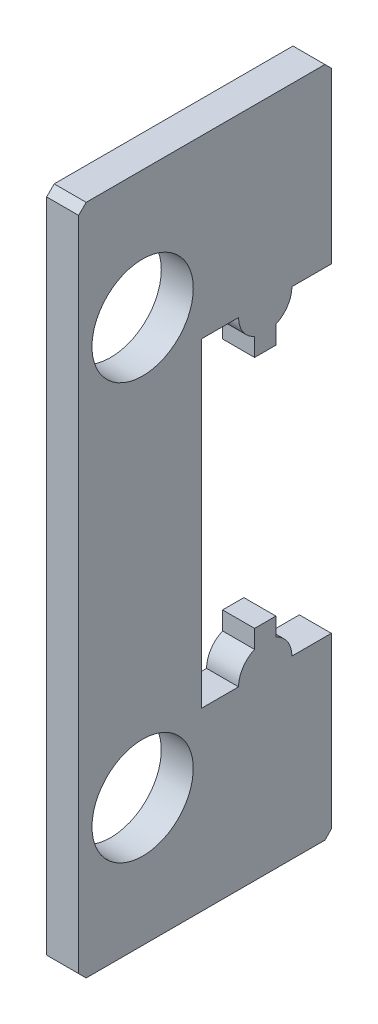
ISO-10303-21;
HEADER;
FILE_DESCRIPTION(('STEP AP214'),'2;1');
FILE_NAME('part.step','',(''),(''),'','','');
FILE_SCHEMA(('AUTOMOTIVE_DESIGN { 1 0 10303 214 1 1 1 1 }'));
ENDSEC;
DATA;
#1=APPLICATION_CONTEXT('core data for automotive mechanical design processes');
#2=APPLICATION_PROTOCOL_DEFINITION('international standard','automotive_design',2000,#1);
#3=PRODUCT_CONTEXT('',#1,'mechanical');
#4=PRODUCT('Part','Part','',(#3));
#5=PRODUCT_RELATED_PRODUCT_CATEGORY('part','',(#4));
#6=PRODUCT_DEFINITION_FORMATION('','',#4);
#7=PRODUCT_DEFINITION_CONTEXT('part definition',#1,'design');
#8=PRODUCT_DEFINITION('design','',#6,#7);
#9=PRODUCT_DEFINITION_SHAPE('','',#8);
#10=(LENGTH_UNIT() NAMED_UNIT(*) SI_UNIT(.MILLI.,.METRE.));
#11=(NAMED_UNIT(*) PLANE_ANGLE_UNIT() SI_UNIT($,.RADIAN.));
#12=(NAMED_UNIT(*) SI_UNIT($,.STERADIAN.) SOLID_ANGLE_UNIT());
#13=UNCERTAINTY_MEASURE_WITH_UNIT(LENGTH_MEASURE(1.E-05),#10,'distance_accuracy_value','');
#14=(GEOMETRIC_REPRESENTATION_CONTEXT(3) GLOBAL_UNCERTAINTY_ASSIGNED_CONTEXT((#13)) GLOBAL_UNIT_ASSIGNED_CONTEXT((#10,
#11,#12)) REPRESENTATION_CONTEXT('',''));
#15=CARTESIAN_POINT('',(0.,0.,0.));
#16=DIRECTION('',(0.,0.,1.));
#17=DIRECTION('',(1.,0.,0.));
#18=AXIS2_PLACEMENT_3D('',#15,#16,#17);
#19=CARTESIAN_POINT('',(19.75,0.,3.5));
#20=DIRECTION('',(-1.,0.,0.));
#21=DIRECTION('',(0.,0.,1.));
#22=AXIS2_PLACEMENT_3D('',#19,#20,#21);
#23=PLANE('',#22);
#24=CARTESIAN_POINT('',(19.75,0.,3.5));
#25=DIRECTION('',(1.,0.,0.));
#26=DIRECTION('',(0.,0.,-1.));
#27=AXIS2_PLACEMENT_3D('',#24,#25,#26);
#28=CIRCLE('',#27,1.41421358344652);
#29=CARTESIAN_POINT('',(19.75,0.,2.08578641655348));
#30=VERTEX_POINT('',#29);
#31=EDGE_CURVE('E20',#30,#30,#28,.F.);
#32=ORIENTED_EDGE('',*,*,#31,.T.);
#33=EDGE_LOOP('',(#32));
#34=FACE_BOUND('',#33,.T.);
#35=ADVANCED_FACE('F17',(#34),#23,.T.);
#36=CARTESIAN_POINT('',(19.25,0.,3.5));
#37=DIRECTION('',(1.,0.,0.));
#38=DIRECTION('',(0.,0.,-1.));
#39=AXIS2_PLACEMENT_3D('',#36,#37,#38);
#40=CYLINDRICAL_SURFACE('',#39,1.41421358344652);
#41=CARTESIAN_POINT('',(19.25,0.,3.5));
#42=DIRECTION('',(1.,0.,0.));
#43=DIRECTION('',(0.,0.,-1.));
#44=AXIS2_PLACEMENT_3D('',#41,#42,#43);
#45=CIRCLE('',#44,1.41421358344652);
#46=CARTESIAN_POINT('',(19.25,0.,2.08578641655348));
#47=VERTEX_POINT('',#46);
#48=EDGE_CURVE('E293',#47,#47,#45,.F.);
#49=ORIENTED_EDGE('',*,*,#48,.T.);
#50=EDGE_LOOP('',(#49));
#51=FACE_BOUND('',#50,.T.);
#52=ORIENTED_EDGE('',*,*,#31,.F.);
#53=EDGE_LOOP('',(#52));
#54=FACE_BOUND('',#53,.T.);
#55=ADVANCED_FACE('F417',(#51,#54),#40,.F.);
#56=CARTESIAN_POINT('',(19.25,15.45,-6.10000000000004));
#57=DIRECTION('',(0.,0.707106781186548,-0.707106781186547));
#58=DIRECTION('',(0.,0.707106781186547,0.707106781186548));
#59=AXIS2_PLACEMENT_3D('',#56,#57,#58);
#60=PLANE('',#59);
#61=DIRECTION('',(0.,0.707106781186547,0.707106781186548));
#62=VECTOR('',#61,1.);
#63=CARTESIAN_POINT('',(20.75,15.45,-6.10000000000004));
#64=LINE('',#63,#62);
#65=CARTESIAN_POINT('',(20.75,15.75,-5.80000000000004));
#66=VERTEX_POINT('',#65);
#67=CARTESIAN_POINT('',(20.75,15.45,-6.10000000000003));
#68=VERTEX_POINT('',#67);
#69=EDGE_CURVE('E347',#66,#68,#64,.F.);
#70=ORIENTED_EDGE('',*,*,#69,.T.);
#71=DIRECTION('',(1.,0.,0.));
#72=VECTOR('',#71,1.);
#73=CARTESIAN_POINT('',(19.25,15.45,-6.10000000000004));
#74=LINE('',#73,#72);
#75=CARTESIAN_POINT('',(19.25,15.45,-6.10000000000004));
#76=VERTEX_POINT('',#75);
#77=EDGE_CURVE('E274',#76,#68,#74,.T.);
#78=ORIENTED_EDGE('',*,*,#77,.F.);
#79=DIRECTION('',(0.,0.707106781186547,0.707106781186549));
#80=VECTOR('',#79,1.);
#81=CARTESIAN_POINT('',(19.25,15.45,-6.10000000000004));
#82=LINE('',#81,#80);
#83=CARTESIAN_POINT('',(19.25,15.75,-5.80000000000004));
#84=VERTEX_POINT('',#83);
#85=EDGE_CURVE('E282',#76,#84,#82,.T.);
#86=ORIENTED_EDGE('',*,*,#85,.T.);
#87=DIRECTION('',(1.,0.,0.));
#88=VECTOR('',#87,1.);
#89=CARTESIAN_POINT('',(19.25,15.75,-5.80000000000004));
#90=LINE('',#89,#88);
#91=EDGE_CURVE('E259',#66,#84,#90,.F.);
#92=ORIENTED_EDGE('',*,*,#91,.F.);
#93=EDGE_LOOP('',(#70,#78,#86,#92));
#94=FACE_BOUND('',#93,.T.);
#95=ADVANCED_FACE('F603',(#94),#60,.T.);
#96=CARTESIAN_POINT('',(19.25,15.75,5.39644660940672));
#97=DIRECTION('',(0.,0.707106781186547,0.707106781186548));
#98=DIRECTION('',(0.,-0.707106781186548,0.707106781186547));
#99=AXIS2_PLACEMENT_3D('',#96,#97,#98);
#100=PLANE('',#99);
#101=DIRECTION('',(0.,-0.707106781186548,0.707106781186547));
#102=VECTOR('',#101,1.);
#103=CARTESIAN_POINT('',(20.75,15.75,5.39644660940672));
#104=LINE('',#103,#102);
#105=CARTESIAN_POINT('',(20.75,15.3964466094067,5.75000000000001));
#106=VERTEX_POINT('',#105);
#107=CARTESIAN_POINT('',(20.75,15.75,5.39644660940672));
#108=VERTEX_POINT('',#107);
#109=EDGE_CURVE('E345',#106,#108,#104,.F.);
#110=ORIENTED_EDGE('',*,*,#109,.T.);
#111=DIRECTION('',(1.,0.,0.));
#112=VECTOR('',#111,1.);
#113=CARTESIAN_POINT('',(19.25,15.75,5.39644660940672));
#114=LINE('',#113,#112);
#115=CARTESIAN_POINT('',(19.25,15.75,5.39644660940672));
#116=VERTEX_POINT('',#115);
#117=EDGE_CURVE('E260',#116,#108,#114,.T.);
#118=ORIENTED_EDGE('',*,*,#117,.F.);
#119=DIRECTION('',(0.,-0.707106781186568,0.707106781186528));
#120=VECTOR('',#119,1.);
#121=CARTESIAN_POINT('',(19.25,15.75,5.39644660940672));
#122=LINE('',#121,#120);
#123=CARTESIAN_POINT('',(19.25,15.3964466094067,5.75));
#124=VERTEX_POINT('',#123);
#125=EDGE_CURVE('E280',#116,#124,#122,.T.);
#126=ORIENTED_EDGE('',*,*,#125,.T.);
#127=DIRECTION('',(1.,0.,0.));
#128=VECTOR('',#127,1.);
#129=CARTESIAN_POINT('',(19.25,15.3964466094067,5.75));
#130=LINE('',#129,#128);
#131=EDGE_CURVE('E249',#106,#124,#130,.F.);
#132=ORIENTED_EDGE('',*,*,#131,.F.);
#133=EDGE_LOOP('',(#110,#118,#126,#132));
#134=FACE_BOUND('',#133,.T.);
#135=ADVANCED_FACE('F592',(#134),#100,.T.);
#136=CARTESIAN_POINT('',(19.25,-15.3964466094067,5.75));
#137=DIRECTION('',(0.,-0.707106781186548,0.707106781186547));
#138=DIRECTION('',(0.,-0.707106781186547,-0.707106781186548));
#139=AXIS2_PLACEMENT_3D('',#136,#137,#138);
#140=PLANE('',#139);
#141=DIRECTION('',(0.,-0.707106781186547,-0.707106781186548));
#142=VECTOR('',#141,1.);
#143=CARTESIAN_POINT('',(20.75,-15.3964466094067,5.75));
#144=LINE('',#143,#142);
#145=CARTESIAN_POINT('',(20.75,-15.75,5.39644660940672));
#146=VERTEX_POINT('',#145);
#147=CARTESIAN_POINT('',(20.75,-15.3964466094067,5.75));
#148=VERTEX_POINT('',#147);
#149=EDGE_CURVE('E144',#146,#148,#144,.F.);
#150=ORIENTED_EDGE('',*,*,#149,.T.);
#151=DIRECTION('',(1.,0.,0.));
#152=VECTOR('',#151,1.);
#153=CARTESIAN_POINT('',(19.25,-15.3964466094067,5.75));
#154=LINE('',#153,#152);
#155=CARTESIAN_POINT('',(19.25,-15.3964466094067,5.75));
#156=VERTEX_POINT('',#155);
#157=EDGE_CURVE('E253',#156,#148,#154,.T.);
#158=ORIENTED_EDGE('',*,*,#157,.F.);
#159=DIRECTION('',(0.,-0.707106781186578,-0.707106781186517));
#160=VECTOR('',#159,1.);
#161=CARTESIAN_POINT('',(19.25,-15.3964466094067,5.75));
#162=LINE('',#161,#160);
#163=CARTESIAN_POINT('',(19.25,-15.75,5.39644660940673));
#164=VERTEX_POINT('',#163);
#165=EDGE_CURVE('E277',#156,#164,#162,.T.);
#166=ORIENTED_EDGE('',*,*,#165,.T.);
#167=DIRECTION('',(1.,0.,0.));
#168=VECTOR('',#167,1.);
#169=CARTESIAN_POINT('',(19.25,-15.75,5.39644660940673));
#170=LINE('',#169,#168);
#171=EDGE_CURVE('E245',#146,#164,#170,.F.);
#172=ORIENTED_EDGE('',*,*,#171,.F.);
#173=EDGE_LOOP('',(#150,#158,#166,#172));
#174=FACE_BOUND('',#173,.T.);
#175=ADVANCED_FACE('F433',(#174),#140,.T.);
#176=CARTESIAN_POINT('',(19.25,-15.75,-5.80000000000007));
#177=DIRECTION('',(0.,-0.707106781186544,-0.707106781186551));
#178=DIRECTION('',(0.,0.707106781186551,-0.707106781186544));
#179=AXIS2_PLACEMENT_3D('',#176,#177,#178);
#180=PLANE('',#179);
#181=DIRECTION('',(0.,0.707106781186551,-0.707106781186544));
#182=VECTOR('',#181,1.);
#183=CARTESIAN_POINT('',(20.75,-15.75,-5.80000000000007));
#184=LINE('',#183,#182);
#185=CARTESIAN_POINT('',(20.75,-15.45,-6.10000000000007));
#186=VERTEX_POINT('',#185);
#187=CARTESIAN_POINT('',(20.75,-15.75,-5.80000000000007));
#188=VERTEX_POINT('',#187);
#189=EDGE_CURVE('E135',#186,#188,#184,.F.);
#190=ORIENTED_EDGE('',*,*,#189,.T.);
#191=DIRECTION('',(1.,0.,0.));
#192=VECTOR('',#191,1.);
#193=CARTESIAN_POINT('',(19.25,-15.75,-5.80000000000007));
#194=LINE('',#193,#192);
#195=CARTESIAN_POINT('',(19.25,-15.75,-5.80000000000007));
#196=VERTEX_POINT('',#195);
#197=EDGE_CURVE('E248',#196,#188,#194,.T.);
#198=ORIENTED_EDGE('',*,*,#197,.F.);
#199=DIRECTION('',(0.,0.707106781186547,-0.707106781186547));
#200=VECTOR('',#199,1.);
#201=CARTESIAN_POINT('',(19.25,-15.75,-5.80000000000007));
#202=LINE('',#201,#200);
#203=CARTESIAN_POINT('',(19.25,-15.45,-6.10000000000007));
#204=VERTEX_POINT('',#203);
#205=EDGE_CURVE('E279',#196,#204,#202,.T.);
#206=ORIENTED_EDGE('',*,*,#205,.T.);
#207=DIRECTION('',(1.,0.,0.));
#208=VECTOR('',#207,1.);
#209=CARTESIAN_POINT('',(19.25,-15.45,-6.10000000000007));
#210=LINE('',#209,#208);
#211=EDGE_CURVE('E239',#186,#204,#210,.F.);
#212=ORIENTED_EDGE('',*,*,#211,.F.);
#213=EDGE_LOOP('',(#190,#198,#206,#212));
#214=FACE_BOUND('',#213,.T.);
#215=ADVANCED_FACE('F422',(#214),#180,.T.);
#216=CARTESIAN_POINT('',(19.25,0.,-0.175000000000037));
#217=DIRECTION('',(1.,0.,0.));
#218=DIRECTION('',(0.,0.,-1.));
#219=AXIS2_PLACEMENT_3D('',#216,#217,#218);
#220=PLANE('',#219);
#221=CARTESIAN_POINT('',(19.25,-9.75,2.75));
#222=DIRECTION('',(-1.,0.,0.));
#223=DIRECTION('',(0.,0.,1.));
#224=AXIS2_PLACEMENT_3D('',#221,#222,#223);
#225=CIRCLE('',#224,2.375);
#226=CARTESIAN_POINT('',(19.25,-9.75,5.125));
#227=VERTEX_POINT('',#226);
#228=EDGE_CURVE('E399',#227,#227,#225,.F.);
#229=ORIENTED_EDGE('',*,*,#228,.T.);
#230=EDGE_LOOP('',(#229));
#231=FACE_BOUND('',#230,.T.);
#232=CARTESIAN_POINT('',(19.25,9.75,2.75));
#233=DIRECTION('',(1.,0.,0.));
#234=DIRECTION('',(0.,0.,-1.));
#235=AXIS2_PLACEMENT_3D('',#232,#233,#234);
#236=CIRCLE('',#235,2.375);
#237=CARTESIAN_POINT('',(19.25,9.75,0.375));
#238=VERTEX_POINT('',#237);
#239=EDGE_CURVE('E402',#238,#238,#236,.T.);
#240=ORIENTED_EDGE('',*,*,#239,.T.);
#241=EDGE_LOOP('',(#240));
#242=FACE_BOUND('',#241,.T.);
#243=ORIENTED_EDGE('',*,*,#48,.F.);
#244=EDGE_LOOP('',(#243));
#245=FACE_BOUND('',#244,.T.);
#246=CARTESIAN_POINT('',(19.25,7.5,-3.));
#247=DIRECTION('',(1.,0.,0.));
#248=DIRECTION('',(0.,0.,-1.));
#249=AXIS2_PLACEMENT_3D('',#246,#247,#248);
#250=CIRCLE('',#249,1.25);
#251=CARTESIAN_POINT('',(19.25,6.35435609902294,-3.50000005215407));
#252=VERTEX_POINT('',#251);
#253=CARTESIAN_POINT('',(19.25,7.5,-4.25));
#254=VERTEX_POINT('',#253);
#255=EDGE_CURVE('E405',#252,#254,#250,.T.);
#256=ORIENTED_EDGE('',*,*,#255,.F.);
#257=DIRECTION('',(0.,1.,0.));
#258=VECTOR('',#257,1.);
#259=CARTESIAN_POINT('',(19.25,5.50000008195638,-3.50000005215407));
#260=LINE('',#259,#258);
#261=CARTESIAN_POINT('',(19.25,5.50000008195638,-3.50000005215407));
#262=VERTEX_POINT('',#261);
#263=EDGE_CURVE('E283',#262,#252,#260,.T.);
#264=ORIENTED_EDGE('',*,*,#263,.F.);
#265=DIRECTION('',(0.,0.,-1.));
#266=VECTOR('',#265,1.);
#267=CARTESIAN_POINT('',(19.25,5.50000008195638,-2.50000003725291));
#268=LINE('',#267,#266);
#269=CARTESIAN_POINT('',(19.25,5.50000008195638,-2.50000003725291));
#270=VERTEX_POINT('',#269);
#271=EDGE_CURVE('E296',#270,#262,#268,.T.);
#272=ORIENTED_EDGE('',*,*,#271,.F.);
#273=DIRECTION('',(0.,-1.,0.));
#274=VECTOR('',#273,1.);
#275=CARTESIAN_POINT('',(19.25,6.35435606000254,-2.50000003725291));
#276=LINE('',#275,#274);
#277=CARTESIAN_POINT('',(19.25,6.35435606000254,-2.50000003725291));
#278=VERTEX_POINT('',#277);
#279=EDGE_CURVE('E302',#278,#270,#276,.T.);
#280=ORIENTED_EDGE('',*,*,#279,.F.);
#281=CARTESIAN_POINT('',(19.25,7.5,-3.));
#282=DIRECTION('',(1.,0.,0.));
#283=DIRECTION('',(0.,0.,-1.));
#284=AXIS2_PLACEMENT_3D('',#281,#282,#283);
#285=CIRCLE('',#284,1.25);
#286=CARTESIAN_POINT('',(19.25,7.5,-1.75));
#287=VERTEX_POINT('',#286);
#288=EDGE_CURVE('E305',#287,#278,#285,.T.);
#289=ORIENTED_EDGE('',*,*,#288,.F.);
#290=DIRECTION('',(0.,0.,-1.));
#291=VECTOR('',#290,1.);
#292=CARTESIAN_POINT('',(19.25,7.5,0.));
#293=LINE('',#292,#291);
#294=CARTESIAN_POINT('',(19.25,7.5,0.));
#295=VERTEX_POINT('',#294);
#296=EDGE_CURVE('E308',#295,#287,#293,.T.);
#297=ORIENTED_EDGE('',*,*,#296,.F.);
#298=DIRECTION('',(0.,1.,0.));
#299=VECTOR('',#298,1.);
#300=CARTESIAN_POINT('',(19.25,-7.5,0.));
#301=LINE('',#300,#299);
#302=CARTESIAN_POINT('',(19.25,-7.5,0.));
#303=VERTEX_POINT('',#302);
#304=EDGE_CURVE('E314',#303,#295,#301,.T.);
#305=ORIENTED_EDGE('',*,*,#304,.F.);
#306=DIRECTION('',(0.,0.,1.));
#307=VECTOR('',#306,1.);
#308=CARTESIAN_POINT('',(19.25,-7.5,-1.75));
#309=LINE('',#308,#307);
#310=CARTESIAN_POINT('',(19.25,-7.5,-1.75));
#311=VERTEX_POINT('',#310);
#312=EDGE_CURVE('E320',#311,#303,#309,.T.);
#313=ORIENTED_EDGE('',*,*,#312,.F.);
#314=CARTESIAN_POINT('',(19.25,-7.5,-3.));
#315=DIRECTION('',(1.,0.,0.));
#316=DIRECTION('',(0.,0.,-1.));
#317=AXIS2_PLACEMENT_3D('',#314,#315,#316);
#318=CIRCLE('',#317,1.25);
#319=CARTESIAN_POINT('',(19.25,-6.35435606000254,-2.5000000372529));
#320=VERTEX_POINT('',#319);
#321=EDGE_CURVE('E323',#320,#311,#318,.T.);
#322=ORIENTED_EDGE('',*,*,#321,.F.);
#323=DIRECTION('',(0.,1.,0.));
#324=VECTOR('',#323,1.);
#325=CARTESIAN_POINT('',(19.25,-5.50000008195639,-2.5000000372529));
#326=LINE('',#325,#324);
#327=CARTESIAN_POINT('',(19.25,-5.50000008195639,-2.5000000372529));
#328=VERTEX_POINT('',#327);
#329=EDGE_CURVE('E197',#328,#320,#326,.F.);
#330=ORIENTED_EDGE('',*,*,#329,.F.);
#331=DIRECTION('',(0.,0.,1.));
#332=VECTOR('',#331,1.);
#333=CARTESIAN_POINT('',(19.25,-5.50000008195639,-3.50000005215406));
#334=LINE('',#333,#332);
#335=CARTESIAN_POINT('',(19.25,-5.50000008195639,-3.50000005215406));
#336=VERTEX_POINT('',#335);
#337=EDGE_CURVE('E190',#336,#328,#334,.T.);
#338=ORIENTED_EDGE('',*,*,#337,.F.);
#339=DIRECTION('',(0.,1.,0.));
#340=VECTOR('',#339,1.);
#341=CARTESIAN_POINT('',(19.25,-6.35435609902294,-3.50000005215406));
#342=LINE('',#341,#340);
#343=CARTESIAN_POINT('',(19.25,-6.35435609902294,-3.50000005215406));
#344=VERTEX_POINT('',#343);
#345=EDGE_CURVE('E194',#344,#336,#342,.T.);
#346=ORIENTED_EDGE('',*,*,#345,.F.);
#347=CARTESIAN_POINT('',(19.25,-7.5,-3.));
#348=DIRECTION('',(1.,0.,0.));
#349=DIRECTION('',(0.,0.,-1.));
#350=AXIS2_PLACEMENT_3D('',#347,#348,#349);
#351=CIRCLE('',#350,1.25);
#352=CARTESIAN_POINT('',(19.25,-7.5,-4.25));
#353=VERTEX_POINT('',#352);
#354=EDGE_CURVE('E209',#353,#344,#351,.T.);
#355=ORIENTED_EDGE('',*,*,#354,.F.);
#356=DIRECTION('',(0.,0.,1.));
#357=VECTOR('',#356,1.);
#358=CARTESIAN_POINT('',(19.25,-7.5,-6.1));
#359=LINE('',#358,#357);
#360=CARTESIAN_POINT('',(19.25,-7.5,-6.1));
#361=VERTEX_POINT('',#360);
#362=EDGE_CURVE('E98',#361,#353,#359,.T.);
#363=ORIENTED_EDGE('',*,*,#362,.F.);
#364=DIRECTION('',(0.,1.,0.));
#365=VECTOR('',#364,1.);
#366=CARTESIAN_POINT('',(19.25,-15.45,-6.10000000000007));
#367=LINE('',#366,#365);
#368=EDGE_CURVE('E242',#204,#361,#367,.T.);
#369=ORIENTED_EDGE('',*,*,#368,.F.);
#370=ORIENTED_EDGE('',*,*,#205,.F.);
#371=DIRECTION('',(0.,0.,-1.));
#372=VECTOR('',#371,1.);
#373=CARTESIAN_POINT('',(19.25,-15.75,5.39644660940673));
#374=LINE('',#373,#372);
#375=EDGE_CURVE('E252',#164,#196,#374,.T.);
#376=ORIENTED_EDGE('',*,*,#375,.F.);
#377=ORIENTED_EDGE('',*,*,#165,.F.);
#378=DIRECTION('',(0.,-1.,0.));
#379=VECTOR('',#378,1.);
#380=CARTESIAN_POINT('',(19.25,15.3964466094067,5.75));
#381=LINE('',#380,#379);
#382=EDGE_CURVE('E256',#124,#156,#381,.T.);
#383=ORIENTED_EDGE('',*,*,#382,.F.);
#384=ORIENTED_EDGE('',*,*,#125,.F.);
#385=DIRECTION('',(0.,0.,1.));
#386=VECTOR('',#385,1.);
#387=CARTESIAN_POINT('',(19.25,15.75,-5.80000000000004));
#388=LINE('',#387,#386);
#389=EDGE_CURVE('E263',#84,#116,#388,.T.);
#390=ORIENTED_EDGE('',*,*,#389,.F.);
#391=ORIENTED_EDGE('',*,*,#85,.F.);
#392=DIRECTION('',(0.,1.,0.));
#393=VECTOR('',#392,1.);
#394=CARTESIAN_POINT('',(19.25,7.5,-6.1));
#395=LINE('',#394,#393);
#396=CARTESIAN_POINT('',(19.25,7.5,-6.1));
#397=VERTEX_POINT('',#396);
#398=EDGE_CURVE('E292',#397,#76,#395,.T.);
#399=ORIENTED_EDGE('',*,*,#398,.F.);
#400=DIRECTION('',(0.,0.,-1.));
#401=VECTOR('',#400,1.);
#402=CARTESIAN_POINT('',(19.25,7.5,-4.25));
#403=LINE('',#402,#401);
#404=EDGE_CURVE('E289',#254,#397,#403,.T.);
#405=ORIENTED_EDGE('',*,*,#404,.F.);
#406=EDGE_LOOP('',(#256,#264,#272,#280,#289,#297,#305,#313,#322,#330,#338,#346,#355,#363,#369,
#370,#376,#377,#383,#384,#390,#391,#399,#405));
#407=FACE_BOUND('',#406,.T.);
#408=ADVANCED_FACE('F193',(#231,#242,#245,#407),#220,.F.);
#409=CARTESIAN_POINT('',(19.25,7.5,-4.25));
#410=DIRECTION('',(0.,-1.,0.));
#411=DIRECTION('',(0.,0.,-1.));
#412=AXIS2_PLACEMENT_3D('',#409,#410,#411);
#413=PLANE('',#412);
#414=DIRECTION('',(0.,0.,-1.));
#415=VECTOR('',#414,1.);
#416=CARTESIAN_POINT('',(20.75,7.5,-0.175000000000037));
#417=LINE('',#416,#415);
#418=CARTESIAN_POINT('',(20.75,7.5,-4.25));
#419=VERTEX_POINT('',#418);
#420=CARTESIAN_POINT('',(20.75,7.5,-6.1));
#421=VERTEX_POINT('',#420);
#422=EDGE_CURVE('E268',#419,#421,#417,.T.);
#423=ORIENTED_EDGE('',*,*,#422,.F.);
#424=DIRECTION('',(1.,0.,0.));
#425=VECTOR('',#424,1.);
#426=CARTESIAN_POINT('',(19.25,7.5,-4.25));
#427=LINE('',#426,#425);
#428=EDGE_CURVE('E534',#254,#419,#427,.T.);
#429=ORIENTED_EDGE('',*,*,#428,.F.);
#430=ORIENTED_EDGE('',*,*,#404,.T.);
#431=DIRECTION('',(1.,0.,0.));
#432=VECTOR('',#431,1.);
#433=CARTESIAN_POINT('',(19.25,7.5,-6.1));
#434=LINE('',#433,#432);
#435=EDGE_CURVE('E271',#421,#397,#434,.F.);
#436=ORIENTED_EDGE('',*,*,#435,.F.);
#437=EDGE_LOOP('',(#423,#429,#430,#436));
#438=FACE_BOUND('',#437,.T.);
#439=ADVANCED_FACE('F421',(#438),#413,.T.);
#440=CARTESIAN_POINT('',(19.25,7.5,-6.1));
#441=DIRECTION('',(0.,0.,-1.));
#442=DIRECTION('',(0.,1.,0.));
#443=AXIS2_PLACEMENT_3D('',#440,#441,#442);
#444=PLANE('',#443);
#445=DIRECTION('',(0.,1.,0.));
#446=VECTOR('',#445,1.);
#447=CARTESIAN_POINT('',(20.75,0.,-6.1));
#448=LINE('',#447,#446);
#449=EDGE_CURVE('E264',#421,#68,#448,.T.);
#450=ORIENTED_EDGE('',*,*,#449,.F.);
#451=ORIENTED_EDGE('',*,*,#435,.T.);
#452=ORIENTED_EDGE('',*,*,#398,.T.);
#453=ORIENTED_EDGE('',*,*,#77,.T.);
#454=EDGE_LOOP('',(#450,#451,#452,#453));
#455=FACE_BOUND('',#454,.T.);
#456=ADVANCED_FACE('F430',(#455),#444,.T.);
#457=CARTESIAN_POINT('',(19.25,15.75,-5.80000000000004));
#458=DIRECTION('',(0.,1.,0.));
#459=DIRECTION('',(0.,0.,1.));
#460=AXIS2_PLACEMENT_3D('',#457,#458,#459);
#461=PLANE('',#460);
#462=DIRECTION('',(0.,0.,-1.));
#463=VECTOR('',#462,1.);
#464=CARTESIAN_POINT('',(20.75,15.75,-0.175000000000037));
#465=LINE('',#464,#463);
#466=EDGE_CURVE('E267',#66,#108,#465,.F.);
#467=ORIENTED_EDGE('',*,*,#466,.F.);
#468=ORIENTED_EDGE('',*,*,#91,.T.);
#469=ORIENTED_EDGE('',*,*,#389,.T.);
#470=ORIENTED_EDGE('',*,*,#117,.T.);
#471=EDGE_LOOP('',(#467,#468,#469,#470));
#472=FACE_BOUND('',#471,.T.);
#473=ADVANCED_FACE('F513',(#472),#461,.T.);
#474=CARTESIAN_POINT('',(19.25,15.3964466094067,5.75));
#475=DIRECTION('',(0.,0.,1.));
#476=DIRECTION('',(0.,-1.,0.));
#477=AXIS2_PLACEMENT_3D('',#474,#475,#476);
#478=PLANE('',#477);
#479=DIRECTION('',(0.,1.,0.));
#480=VECTOR('',#479,1.);
#481=CARTESIAN_POINT('',(20.75,0.,5.75));
#482=LINE('',#481,#480);
#483=EDGE_CURVE('E376',#106,#148,#482,.F.);
#484=ORIENTED_EDGE('',*,*,#483,.F.);
#485=ORIENTED_EDGE('',*,*,#131,.T.);
#486=ORIENTED_EDGE('',*,*,#382,.T.);
#487=ORIENTED_EDGE('',*,*,#157,.T.);
#488=EDGE_LOOP('',(#484,#485,#486,#487));
#489=FACE_BOUND('',#488,.T.);
#490=ADVANCED_FACE('F509',(#489),#478,.T.);
#491=CARTESIAN_POINT('',(19.25,-15.75,5.39644660940673));
#492=DIRECTION('',(0.,-1.,0.));
#493=DIRECTION('',(0.,0.,-1.));
#494=AXIS2_PLACEMENT_3D('',#491,#492,#493);
#495=PLANE('',#494);
#496=DIRECTION('',(0.,0.,-1.));
#497=VECTOR('',#496,1.);
#498=CARTESIAN_POINT('',(20.75,-15.75,-0.175000000000037));
#499=LINE('',#498,#497);
#500=EDGE_CURVE('E236',#146,#188,#499,.T.);
#501=ORIENTED_EDGE('',*,*,#500,.F.);
#502=ORIENTED_EDGE('',*,*,#171,.T.);
#503=ORIENTED_EDGE('',*,*,#375,.T.);
#504=ORIENTED_EDGE('',*,*,#197,.T.);
#505=EDGE_LOOP('',(#501,#502,#503,#504));
#506=FACE_BOUND('',#505,.T.);
#507=ADVANCED_FACE('F505',(#506),#495,.T.);
#508=CARTESIAN_POINT('',(19.25,-15.45,-6.10000000000007));
#509=DIRECTION('',(0.,0.,-1.));
#510=DIRECTION('',(0.,1.,0.));
#511=AXIS2_PLACEMENT_3D('',#508,#509,#510);
#512=PLANE('',#511);
#513=DIRECTION('',(0.,1.,0.));
#514=VECTOR('',#513,1.);
#515=CARTESIAN_POINT('',(20.75,0.,-6.10000000000007));
#516=LINE('',#515,#514);
#517=CARTESIAN_POINT('',(20.75,-7.5,-6.10000000000005));
#518=VERTEX_POINT('',#517);
#519=EDGE_CURVE('E232',#186,#518,#516,.T.);
#520=ORIENTED_EDGE('',*,*,#519,.F.);
#521=ORIENTED_EDGE('',*,*,#211,.T.);
#522=ORIENTED_EDGE('',*,*,#368,.T.);
#523=DIRECTION('',(1.,0.,0.));
#524=VECTOR('',#523,1.);
#525=CARTESIAN_POINT('',(19.25,-7.5,-6.1));
#526=LINE('',#525,#524);
#527=EDGE_CURVE('E228',#518,#361,#526,.F.);
#528=ORIENTED_EDGE('',*,*,#527,.F.);
#529=EDGE_LOOP('',(#520,#521,#522,#528));
#530=FACE_BOUND('',#529,.T.);
#531=ADVANCED_FACE('F502',(#530),#512,.T.);
#532=CARTESIAN_POINT('',(19.25,-7.5,-6.1));
#533=DIRECTION('',(0.,1.,0.));
#534=DIRECTION('',(0.,0.,1.));
#535=AXIS2_PLACEMENT_3D('',#532,#533,#534);
#536=PLANE('',#535);
#537=DIRECTION('',(0.,0.,-1.));
#538=VECTOR('',#537,1.);
#539=CARTESIAN_POINT('',(20.75,-7.5,-0.175000000000037));
#540=LINE('',#539,#538);
#541=CARTESIAN_POINT('',(20.75,-7.5,-4.25));
#542=VERTEX_POINT('',#541);
#543=EDGE_CURVE('E235',#518,#542,#540,.F.);
#544=ORIENTED_EDGE('',*,*,#543,.F.);
#545=ORIENTED_EDGE('',*,*,#527,.T.);
#546=ORIENTED_EDGE('',*,*,#362,.T.);
#547=DIRECTION('',(1.,0.,0.));
#548=VECTOR('',#547,1.);
#549=CARTESIAN_POINT('',(19.25,-7.5,-4.25));
#550=LINE('',#549,#548);
#551=EDGE_CURVE('E225',#542,#353,#550,.F.);
#552=ORIENTED_EDGE('',*,*,#551,.F.);
#553=EDGE_LOOP('',(#544,#545,#546,#552));
#554=FACE_BOUND('',#553,.T.);
#555=ADVANCED_FACE('F498',(#554),#536,.T.);
#556=CARTESIAN_POINT('',(19.25,-7.5,-3.));
#557=DIRECTION('',(1.,0.,0.));
#558=DIRECTION('',(0.,0.,-1.));
#559=AXIS2_PLACEMENT_3D('',#556,#557,#558);
#560=CYLINDRICAL_SURFACE('',#559,1.25);
#561=DIRECTION('',(-1.,0.,0.));
#562=VECTOR('',#561,1.);
#563=CARTESIAN_POINT('',(19.25,-6.35435609902294,-3.50000005215406));
#564=LINE('',#563,#562);
#565=CARTESIAN_POINT('',(20.75,-6.35435609902294,-3.50000005215406));
#566=VERTEX_POINT('',#565);
#567=EDGE_CURVE('E202',#566,#344,#564,.T.);
#568=ORIENTED_EDGE('',*,*,#567,.F.);
#569=CARTESIAN_POINT('',(20.75,-7.5,-3.));
#570=DIRECTION('',(1.,0.,0.));
#571=DIRECTION('',(0.,0.,-1.));
#572=AXIS2_PLACEMENT_3D('',#569,#570,#571);
#573=CIRCLE('',#572,1.25);
#574=EDGE_CURVE('E395',#542,#566,#573,.T.);
#575=ORIENTED_EDGE('',*,*,#574,.F.);
#576=ORIENTED_EDGE('',*,*,#551,.T.);
#577=ORIENTED_EDGE('',*,*,#354,.T.);
#578=EDGE_LOOP('',(#568,#575,#576,#577));
#579=FACE_BOUND('',#578,.T.);
#580=ADVANCED_FACE('F495',(#579),#560,.T.);
#581=CARTESIAN_POINT('',(19.25,-6.35435609902294,-3.50000005215406));
#582=DIRECTION('',(0.,0.,-1.));
#583=DIRECTION('',(-1.,0.,0.));
#584=AXIS2_PLACEMENT_3D('',#581,#582,#583);
#585=PLANE('',#584);
#586=DIRECTION('',(0.,1.,0.));
#587=VECTOR('',#586,1.);
#588=CARTESIAN_POINT('',(20.75,0.,-3.50000005215406));
#589=LINE('',#588,#587);
#590=CARTESIAN_POINT('',(20.75,-5.50000008195639,-3.50000005215406));
#591=VERTEX_POINT('',#590);
#592=EDGE_CURVE('E398',#566,#591,#589,.T.);
#593=ORIENTED_EDGE('',*,*,#592,.F.);
#594=ORIENTED_EDGE('',*,*,#567,.T.);
#595=ORIENTED_EDGE('',*,*,#345,.T.);
#596=DIRECTION('',(1.,0.,0.));
#597=VECTOR('',#596,1.);
#598=CARTESIAN_POINT('',(19.25,-5.50000008195639,-3.50000005215406));
#599=LINE('',#598,#597);
#600=EDGE_CURVE('E201',#591,#336,#599,.F.);
#601=ORIENTED_EDGE('',*,*,#600,.F.);
#602=EDGE_LOOP('',(#593,#594,#595,#601));
#603=FACE_BOUND('',#602,.T.);
#604=ADVANCED_FACE('F207',(#603),#585,.T.);
#605=CARTESIAN_POINT('',(19.25,-5.50000008195639,-3.50000005215406));
#606=DIRECTION('',(0.,1.,0.));
#607=DIRECTION('',(0.,0.,1.));
#608=AXIS2_PLACEMENT_3D('',#605,#606,#607);
#609=PLANE('',#608);
#610=DIRECTION('',(0.,0.,-1.));
#611=VECTOR('',#610,1.);
#612=CARTESIAN_POINT('',(20.75,-5.50000008195639,-0.175000000000037));
#613=LINE('',#612,#611);
#614=CARTESIAN_POINT('',(20.75,-5.50000008195639,-2.5000000372529));
#615=VERTEX_POINT('',#614);
#616=EDGE_CURVE('E213',#591,#615,#613,.F.);
#617=ORIENTED_EDGE('',*,*,#616,.F.);
#618=ORIENTED_EDGE('',*,*,#600,.T.);
#619=ORIENTED_EDGE('',*,*,#337,.T.);
#620=DIRECTION('',(1.,0.,0.));
#621=VECTOR('',#620,1.);
#622=CARTESIAN_POINT('',(19.25,-5.50000008195639,-2.5000000372529));
#623=LINE('',#622,#621);
#624=EDGE_CURVE('E216',#615,#328,#623,.F.);
#625=ORIENTED_EDGE('',*,*,#624,.F.);
#626=EDGE_LOOP('',(#617,#618,#619,#625));
#627=FACE_BOUND('',#626,.T.);
#628=ADVANCED_FACE('F211',(#627),#609,.T.);
#629=CARTESIAN_POINT('',(19.25,-5.50000008195639,-2.5000000372529));
#630=DIRECTION('',(0.,0.,1.));
#631=DIRECTION('',(1.,0.,0.));
#632=AXIS2_PLACEMENT_3D('',#629,#630,#631);
#633=PLANE('',#632);
#634=DIRECTION('',(0.,1.,0.));
#635=VECTOR('',#634,1.);
#636=CARTESIAN_POINT('',(20.75,0.,-2.5000000372529));
#637=LINE('',#636,#635);
#638=CARTESIAN_POINT('',(20.75,-6.35435606000254,-2.5000000372529));
#639=VERTEX_POINT('',#638);
#640=EDGE_CURVE('E394',#615,#639,#637,.F.);
#641=ORIENTED_EDGE('',*,*,#640,.F.);
#642=ORIENTED_EDGE('',*,*,#624,.T.);
#643=ORIENTED_EDGE('',*,*,#329,.T.);
#644=DIRECTION('',(1.,0.,0.));
#645=VECTOR('',#644,1.);
#646=CARTESIAN_POINT('',(19.25,-6.35435606000254,-2.5000000372529));
#647=LINE('',#646,#645);
#648=EDGE_CURVE('E413',#639,#320,#647,.F.);
#649=ORIENTED_EDGE('',*,*,#648,.F.);
#650=EDGE_LOOP('',(#641,#642,#643,#649));
#651=FACE_BOUND('',#650,.T.);
#652=ADVANCED_FACE('F486',(#651),#633,.T.);
#653=CARTESIAN_POINT('',(19.25,-7.5,-3.));
#654=DIRECTION('',(1.,0.,0.));
#655=DIRECTION('',(0.,0.,-1.));
#656=AXIS2_PLACEMENT_3D('',#653,#654,#655);
#657=CYLINDRICAL_SURFACE('',#656,1.25);
#658=ORIENTED_EDGE('',*,*,#648,.T.);
#659=ORIENTED_EDGE('',*,*,#321,.T.);
#660=DIRECTION('',(1.,0.,0.));
#661=VECTOR('',#660,1.);
#662=CARTESIAN_POINT('',(19.25,-7.5,-1.75));
#663=LINE('',#662,#661);
#664=CARTESIAN_POINT('',(20.75,-7.5,-1.75));
#665=VERTEX_POINT('',#664);
#666=EDGE_CURVE('E317',#665,#311,#663,.F.);
#667=ORIENTED_EDGE('',*,*,#666,.F.);
#668=CARTESIAN_POINT('',(20.75,-7.5,-3.));
#669=DIRECTION('',(1.,0.,0.));
#670=DIRECTION('',(0.,0.,-1.));
#671=AXIS2_PLACEMENT_3D('',#668,#669,#670);
#672=CIRCLE('',#671,1.25);
#673=EDGE_CURVE('E390',#639,#665,#672,.T.);
#674=ORIENTED_EDGE('',*,*,#673,.F.);
#675=EDGE_LOOP('',(#658,#659,#667,#674));
#676=FACE_BOUND('',#675,.T.);
#677=ADVANCED_FACE('F482',(#676),#657,.T.);
#678=CARTESIAN_POINT('',(19.25,-7.5,-1.75));
#679=DIRECTION('',(0.,1.,0.));
#680=DIRECTION('',(0.,0.,1.));
#681=AXIS2_PLACEMENT_3D('',#678,#679,#680);
#682=PLANE('',#681);
#683=DIRECTION('',(0.,0.,-1.));
#684=VECTOR('',#683,1.);
#685=CARTESIAN_POINT('',(20.75,-7.5,-0.175000000000037));
#686=LINE('',#685,#684);
#687=CARTESIAN_POINT('',(20.75,-7.5,0.));
#688=VERTEX_POINT('',#687);
#689=EDGE_CURVE('E393',#665,#688,#686,.F.);
#690=ORIENTED_EDGE('',*,*,#689,.F.);
#691=ORIENTED_EDGE('',*,*,#666,.T.);
#692=ORIENTED_EDGE('',*,*,#312,.T.);
#693=DIRECTION('',(1.,0.,0.));
#694=VECTOR('',#693,1.);
#695=CARTESIAN_POINT('',(19.25,-7.5,0.));
#696=LINE('',#695,#694);
#697=EDGE_CURVE('E311',#688,#303,#696,.F.);
#698=ORIENTED_EDGE('',*,*,#697,.F.);
#699=EDGE_LOOP('',(#690,#691,#692,#698));
#700=FACE_BOUND('',#699,.T.);
#701=ADVANCED_FACE('F478',(#700),#682,.T.);
#702=CARTESIAN_POINT('',(19.25,-7.5,0.));
#703=DIRECTION('',(0.,0.,-1.));
#704=DIRECTION('',(0.,1.,0.));
#705=AXIS2_PLACEMENT_3D('',#702,#703,#704);
#706=PLANE('',#705);
#707=DIRECTION('',(0.,1.,0.));
#708=VECTOR('',#707,1.);
#709=CARTESIAN_POINT('',(20.75,0.,0.));
#710=LINE('',#709,#708);
#711=CARTESIAN_POINT('',(20.75,7.5,0.));
#712=VERTEX_POINT('',#711);
#713=EDGE_CURVE('E558',#688,#712,#710,.T.);
#714=ORIENTED_EDGE('',*,*,#713,.F.);
#715=ORIENTED_EDGE('',*,*,#697,.T.);
#716=ORIENTED_EDGE('',*,*,#304,.T.);
#717=DIRECTION('',(1.,0.,0.));
#718=VECTOR('',#717,1.);
#719=CARTESIAN_POINT('',(19.25,7.5,0.));
#720=LINE('',#719,#718);
#721=EDGE_CURVE('E310',#712,#295,#720,.F.);
#722=ORIENTED_EDGE('',*,*,#721,.F.);
#723=EDGE_LOOP('',(#714,#715,#716,#722));
#724=FACE_BOUND('',#723,.T.);
#725=ADVANCED_FACE('F474',(#724),#706,.T.);
#726=CARTESIAN_POINT('',(19.25,7.5,0.));
#727=DIRECTION('',(0.,-1.,0.));
#728=DIRECTION('',(0.,0.,-1.));
#729=AXIS2_PLACEMENT_3D('',#726,#727,#728);
#730=PLANE('',#729);
#731=DIRECTION('',(0.,0.,-1.));
#732=VECTOR('',#731,1.);
#733=CARTESIAN_POINT('',(20.75,7.5,-0.175000000000037));
#734=LINE('',#733,#732);
#735=CARTESIAN_POINT('',(20.75,7.5,-1.75));
#736=VERTEX_POINT('',#735);
#737=EDGE_CURVE('E389',#712,#736,#734,.T.);
#738=ORIENTED_EDGE('',*,*,#737,.F.);
#739=ORIENTED_EDGE('',*,*,#721,.T.);
#740=ORIENTED_EDGE('',*,*,#296,.T.);
#741=DIRECTION('',(1.,0.,0.));
#742=VECTOR('',#741,1.);
#743=CARTESIAN_POINT('',(19.25,7.5,-1.75));
#744=LINE('',#743,#742);
#745=EDGE_CURVE('E410',#736,#287,#744,.F.);
#746=ORIENTED_EDGE('',*,*,#745,.F.);
#747=EDGE_LOOP('',(#738,#739,#740,#746));
#748=FACE_BOUND('',#747,.T.);
#749=ADVANCED_FACE('F470',(#748),#730,.T.);
#750=CARTESIAN_POINT('',(19.25,7.5,-3.));
#751=DIRECTION('',(1.,0.,0.));
#752=DIRECTION('',(0.,0.,-1.));
#753=AXIS2_PLACEMENT_3D('',#750,#751,#752);
#754=CYLINDRICAL_SURFACE('',#753,1.25);
#755=DIRECTION('',(1.,0.,0.));
#756=VECTOR('',#755,1.);
#757=CARTESIAN_POINT('',(19.25,6.35435606000254,-2.50000003725291));
#758=LINE('',#757,#756);
#759=CARTESIAN_POINT('',(20.75,6.35435606000254,-2.50000003725291));
#760=VERTEX_POINT('',#759);
#761=EDGE_CURVE('E299',#760,#278,#758,.F.);
#762=ORIENTED_EDGE('',*,*,#761,.F.);
#763=CARTESIAN_POINT('',(20.75,7.5,-3.));
#764=DIRECTION('',(1.,0.,0.));
#765=DIRECTION('',(0.,0.,-1.));
#766=AXIS2_PLACEMENT_3D('',#763,#764,#765);
#767=CIRCLE('',#766,1.25);
#768=EDGE_CURVE('E385',#736,#760,#767,.T.);
#769=ORIENTED_EDGE('',*,*,#768,.F.);
#770=ORIENTED_EDGE('',*,*,#745,.T.);
#771=ORIENTED_EDGE('',*,*,#288,.T.);
#772=EDGE_LOOP('',(#762,#769,#770,#771));
#773=FACE_BOUND('',#772,.T.);
#774=ADVANCED_FACE('F466',(#773),#754,.T.);
#775=CARTESIAN_POINT('',(19.25,6.35435606000254,-2.50000003725291));
#776=DIRECTION('',(0.,0.,1.));
#777=DIRECTION('',(0.,-1.,0.));
#778=AXIS2_PLACEMENT_3D('',#775,#776,#777);
#779=PLANE('',#778);
#780=DIRECTION('',(0.,1.,0.));
#781=VECTOR('',#780,1.);
#782=CARTESIAN_POINT('',(20.75,0.,-2.50000003725291));
#783=LINE('',#782,#781);
#784=CARTESIAN_POINT('',(20.75,5.50000008195638,-2.50000003725291));
#785=VERTEX_POINT('',#784);
#786=EDGE_CURVE('E388',#760,#785,#783,.F.);
#787=ORIENTED_EDGE('',*,*,#786,.F.);
#788=ORIENTED_EDGE('',*,*,#761,.T.);
#789=ORIENTED_EDGE('',*,*,#279,.T.);
#790=DIRECTION('',(1.,0.,0.));
#791=VECTOR('',#790,1.);
#792=CARTESIAN_POINT('',(19.25,5.50000008195638,-2.50000003725291));
#793=LINE('',#792,#791);
#794=EDGE_CURVE('E286',#785,#270,#793,.F.);
#795=ORIENTED_EDGE('',*,*,#794,.F.);
#796=EDGE_LOOP('',(#787,#788,#789,#795));
#797=FACE_BOUND('',#796,.T.);
#798=ADVANCED_FACE('F462',(#797),#779,.T.);
#799=CARTESIAN_POINT('',(19.25,5.50000008195638,-2.50000003725291));
#800=DIRECTION('',(0.,-1.,0.));
#801=DIRECTION('',(0.,0.,-1.));
#802=AXIS2_PLACEMENT_3D('',#799,#800,#801);
#803=PLANE('',#802);
#804=DIRECTION('',(0.,0.,-1.));
#805=VECTOR('',#804,1.);
#806=CARTESIAN_POINT('',(20.75,5.50000008195638,-0.175000000000037));
#807=LINE('',#806,#805);
#808=CARTESIAN_POINT('',(20.75,5.50000008195638,-3.50000005215407));
#809=VERTEX_POINT('',#808);
#810=EDGE_CURVE('E541',#785,#809,#807,.T.);
#811=ORIENTED_EDGE('',*,*,#810,.F.);
#812=ORIENTED_EDGE('',*,*,#794,.T.);
#813=ORIENTED_EDGE('',*,*,#271,.T.);
#814=DIRECTION('',(1.,0.,0.));
#815=VECTOR('',#814,1.);
#816=CARTESIAN_POINT('',(19.25,5.50000008195638,-3.50000005215407));
#817=LINE('',#816,#815);
#818=EDGE_CURVE('E285',#809,#262,#817,.F.);
#819=ORIENTED_EDGE('',*,*,#818,.F.);
#820=EDGE_LOOP('',(#811,#812,#813,#819));
#821=FACE_BOUND('',#820,.T.);
#822=ADVANCED_FACE('F459',(#821),#803,.T.);
#823=CARTESIAN_POINT('',(19.25,5.50000008195638,-3.50000005215407));
#824=DIRECTION('',(0.,0.,-1.));
#825=DIRECTION('',(0.,1.,0.));
#826=AXIS2_PLACEMENT_3D('',#823,#824,#825);
#827=PLANE('',#826);
#828=DIRECTION('',(0.,1.,0.));
#829=VECTOR('',#828,1.);
#830=CARTESIAN_POINT('',(20.75,0.,-3.50000005215407));
#831=LINE('',#830,#829);
#832=CARTESIAN_POINT('',(20.75,6.35435609902294,-3.50000005215407));
#833=VERTEX_POINT('',#832);
#834=EDGE_CURVE('E384',#809,#833,#831,.T.);
#835=ORIENTED_EDGE('',*,*,#834,.F.);
#836=ORIENTED_EDGE('',*,*,#818,.T.);
#837=ORIENTED_EDGE('',*,*,#263,.T.);
#838=DIRECTION('',(1.,0.,0.));
#839=VECTOR('',#838,1.);
#840=CARTESIAN_POINT('',(19.25,6.35435609902294,-3.50000005215407));
#841=LINE('',#840,#839);
#842=EDGE_CURVE('E35',#833,#252,#841,.F.);
#843=ORIENTED_EDGE('',*,*,#842,.F.);
#844=EDGE_LOOP('',(#835,#836,#837,#843));
#845=FACE_BOUND('',#844,.T.);
#846=ADVANCED_FACE('F455',(#845),#827,.T.);
#847=CARTESIAN_POINT('',(19.25,7.5,-3.));
#848=DIRECTION('',(1.,0.,0.));
#849=DIRECTION('',(0.,0.,-1.));
#850=AXIS2_PLACEMENT_3D('',#847,#848,#849);
#851=CYLINDRICAL_SURFACE('',#850,1.25);
#852=ORIENTED_EDGE('',*,*,#842,.T.);
#853=ORIENTED_EDGE('',*,*,#255,.T.);
#854=ORIENTED_EDGE('',*,*,#428,.T.);
#855=CARTESIAN_POINT('',(20.75,7.5,-3.));
#856=DIRECTION('',(1.,0.,0.));
#857=DIRECTION('',(0.,0.,-1.));
#858=AXIS2_PLACEMENT_3D('',#855,#856,#857);
#859=CIRCLE('',#858,1.25);
#860=EDGE_CURVE('E381',#833,#419,#859,.T.);
#861=ORIENTED_EDGE('',*,*,#860,.F.);
#862=EDGE_LOOP('',(#852,#853,#854,#861));
#863=FACE_BOUND('',#862,.T.);
#864=ADVANCED_FACE('F451',(#863),#851,.T.);
#865=CARTESIAN_POINT('',(20.75,9.75,2.75));
#866=DIRECTION('',(1.,0.,0.));
#867=DIRECTION('',(0.,0.,-1.));
#868=AXIS2_PLACEMENT_3D('',#865,#866,#867);
#869=CYLINDRICAL_SURFACE('',#868,2.375);
#870=CARTESIAN_POINT('',(20.75,9.75,2.75));
#871=DIRECTION('',(1.,0.,0.));
#872=DIRECTION('',(0.,0.,-1.));
#873=AXIS2_PLACEMENT_3D('',#870,#871,#872);
#874=CIRCLE('',#873,2.375);
#875=CARTESIAN_POINT('',(20.75,9.75,0.375));
#876=VERTEX_POINT('',#875);
#877=EDGE_CURVE('E26',#876,#876,#874,.F.);
#878=ORIENTED_EDGE('',*,*,#877,.F.);
#879=EDGE_LOOP('',(#878));
#880=FACE_BOUND('',#879,.T.);
#881=ORIENTED_EDGE('',*,*,#239,.F.);
#882=EDGE_LOOP('',(#881));
#883=FACE_BOUND('',#882,.T.);
#884=ADVANCED_FACE('F444',(#880,#883),#869,.F.);
#885=CARTESIAN_POINT('',(20.75,-9.75,2.75));
#886=DIRECTION('',(-1.,0.,0.));
#887=DIRECTION('',(0.,0.,1.));
#888=AXIS2_PLACEMENT_3D('',#885,#886,#887);
#889=CYLINDRICAL_SURFACE('',#888,2.375);
#890=CARTESIAN_POINT('',(20.75,-9.75,2.75));
#891=DIRECTION('',(-1.,0.,0.));
#892=DIRECTION('',(0.,0.,1.));
#893=AXIS2_PLACEMENT_3D('',#890,#891,#892);
#894=CIRCLE('',#893,2.375);
#895=CARTESIAN_POINT('',(20.75,-9.75,5.125));
#896=VERTEX_POINT('',#895);
#897=EDGE_CURVE('E11',#896,#896,#894,.T.);
#898=ORIENTED_EDGE('',*,*,#897,.F.);
#899=EDGE_LOOP('',(#898));
#900=FACE_BOUND('',#899,.T.);
#901=ORIENTED_EDGE('',*,*,#228,.F.);
#902=EDGE_LOOP('',(#901));
#903=FACE_BOUND('',#902,.T.);
#904=ADVANCED_FACE('F438',(#900,#903),#889,.F.);
#905=CARTESIAN_POINT('',(20.75,0.,-0.175000000000037));
#906=DIRECTION('',(1.,0.,0.));
#907=DIRECTION('',(0.,0.,-1.));
#908=AXIS2_PLACEMENT_3D('',#905,#906,#907);
#909=PLANE('',#908);
#910=ORIENTED_EDGE('',*,*,#897,.T.);
#911=EDGE_LOOP('',(#910));
#912=FACE_BOUND('',#911,.T.);
#913=ORIENTED_EDGE('',*,*,#877,.T.);
#914=EDGE_LOOP('',(#913));
#915=FACE_BOUND('',#914,.T.);
#916=ORIENTED_EDGE('',*,*,#834,.T.);
#917=ORIENTED_EDGE('',*,*,#860,.T.);
#918=ORIENTED_EDGE('',*,*,#422,.T.);
#919=ORIENTED_EDGE('',*,*,#449,.T.);
#920=ORIENTED_EDGE('',*,*,#69,.F.);
#921=ORIENTED_EDGE('',*,*,#466,.T.);
#922=ORIENTED_EDGE('',*,*,#109,.F.);
#923=ORIENTED_EDGE('',*,*,#483,.T.);
#924=ORIENTED_EDGE('',*,*,#149,.F.);
#925=ORIENTED_EDGE('',*,*,#500,.T.);
#926=ORIENTED_EDGE('',*,*,#189,.F.);
#927=ORIENTED_EDGE('',*,*,#519,.T.);
#928=ORIENTED_EDGE('',*,*,#543,.T.);
#929=ORIENTED_EDGE('',*,*,#574,.T.);
#930=ORIENTED_EDGE('',*,*,#592,.T.);
#931=ORIENTED_EDGE('',*,*,#616,.T.);
#932=ORIENTED_EDGE('',*,*,#640,.T.);
#933=ORIENTED_EDGE('',*,*,#673,.T.);
#934=ORIENTED_EDGE('',*,*,#689,.T.);
#935=ORIENTED_EDGE('',*,*,#713,.T.);
#936=ORIENTED_EDGE('',*,*,#737,.T.);
#937=ORIENTED_EDGE('',*,*,#768,.T.);
#938=ORIENTED_EDGE('',*,*,#786,.T.);
#939=ORIENTED_EDGE('',*,*,#810,.T.);
#940=EDGE_LOOP('',(#916,#917,#918,#919,#920,#921,#922,#923,#924,#925,#926,#927,#928,#929,#930,
#931,#932,#933,#934,#935,#936,#937,#938,#939));
#941=FACE_BOUND('',#940,.T.);
#942=ADVANCED_FACE('F436',(#912,#915,#941),#909,.T.);
#943=CLOSED_SHELL('',(#35,#55,#95,#135,#175,#215,#408,#439,#456,#473,#490,#507,#531,#555,#580,
#604,#628,#652,#677,#701,#725,#749,#774,#798,#822,#846,#864,#884,#904,#942));
#944=MANIFOLD_SOLID_BREP('B1',#943);
#945=ADVANCED_BREP_SHAPE_REPRESENTATION('',(#18,#944),#14);
#946=SHAPE_DEFINITION_REPRESENTATION(#9,#945);
ENDSEC;
END-ISO-10303-21;
